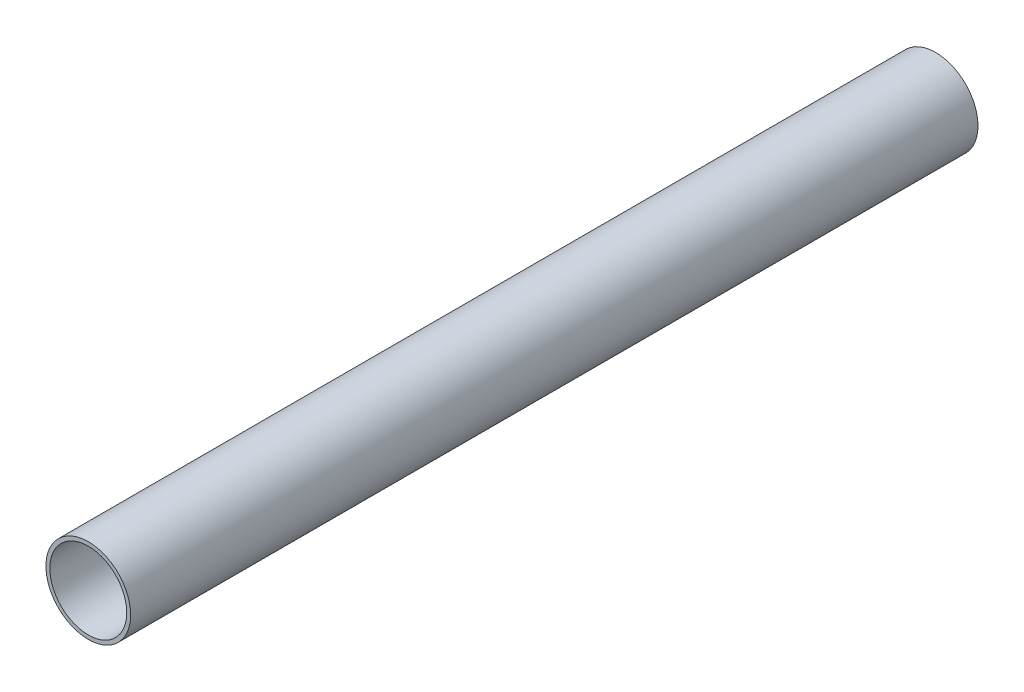
ISO-10303-21;
HEADER;
FILE_DESCRIPTION(('STEP AP214'),'2;1');
FILE_NAME('part.step','',(''),(''),'','','');
FILE_SCHEMA(('AUTOMOTIVE_DESIGN { 1 0 10303 214 1 1 1 1 }'));
ENDSEC;
DATA;
#1=APPLICATION_CONTEXT('core data for automotive mechanical design processes');
#2=APPLICATION_PROTOCOL_DEFINITION('international standard','automotive_design',2000,#1);
#3=PRODUCT_CONTEXT('',#1,'mechanical');
#4=PRODUCT('Part','Part','',(#3));
#5=PRODUCT_RELATED_PRODUCT_CATEGORY('part','',(#4));
#6=PRODUCT_DEFINITION_FORMATION('','',#4);
#7=PRODUCT_DEFINITION_CONTEXT('part definition',#1,'design');
#8=PRODUCT_DEFINITION('design','',#6,#7);
#9=PRODUCT_DEFINITION_SHAPE('','',#8);
#10=(LENGTH_UNIT() NAMED_UNIT(*) SI_UNIT(.MILLI.,.METRE.));
#11=(NAMED_UNIT(*) PLANE_ANGLE_UNIT() SI_UNIT($,.RADIAN.));
#12=(NAMED_UNIT(*) SI_UNIT($,.STERADIAN.) SOLID_ANGLE_UNIT());
#13=UNCERTAINTY_MEASURE_WITH_UNIT(LENGTH_MEASURE(1.E-05),#10,'distance_accuracy_value','');
#14=(GEOMETRIC_REPRESENTATION_CONTEXT(3) GLOBAL_UNCERTAINTY_ASSIGNED_CONTEXT((#13)) GLOBAL_UNIT_ASSIGNED_CONTEXT((#10,
#11,#12)) REPRESENTATION_CONTEXT('',''));
#15=CARTESIAN_POINT('',(0.,0.,0.));
#16=DIRECTION('',(0.,0.,1.));
#17=DIRECTION('',(1.,0.,0.));
#18=AXIS2_PLACEMENT_3D('',#15,#16,#17);
#19=CARTESIAN_POINT('',(0.,0.,250.));
#20=DIRECTION('',(0.,0.,1.));
#21=DIRECTION('',(1.,0.,0.));
#22=AXIS2_PLACEMENT_3D('',#19,#20,#21);
#23=PLANE('',#22);
#24=CARTESIAN_POINT('',(0.,0.,250.));
#25=DIRECTION('',(0.,0.,1.));
#26=DIRECTION('',(1.,0.,0.));
#27=AXIS2_PLACEMENT_3D('',#24,#25,#26);
#28=CIRCLE('',#27,12.5);
#29=CARTESIAN_POINT('',(12.5,0.,250.));
#30=VERTEX_POINT('',#29);
#31=EDGE_CURVE('E10',#30,#30,#28,.T.);
#32=ORIENTED_EDGE('',*,*,#31,.T.);
#33=EDGE_LOOP('',(#32));
#34=FACE_BOUND('',#33,.T.);
#35=CARTESIAN_POINT('',(0.,0.,250.));
#36=DIRECTION('',(0.,0.,1.));
#37=DIRECTION('',(1.,0.,0.));
#38=AXIS2_PLACEMENT_3D('',#35,#36,#37);
#39=CIRCLE('',#38,11.35);
#40=CARTESIAN_POINT('',(11.35,0.,250.));
#41=VERTEX_POINT('',#40);
#42=EDGE_CURVE('E48',#41,#41,#39,.T.);
#43=ORIENTED_EDGE('',*,*,#42,.F.);
#44=EDGE_LOOP('',(#43));
#45=FACE_BOUND('',#44,.T.);
#46=ADVANCED_FACE('F36',(#34,#45),#23,.T.);
#47=CARTESIAN_POINT('',(0.,0.,0.));
#48=DIRECTION('',(0.,0.,1.));
#49=DIRECTION('',(1.,0.,0.));
#50=AXIS2_PLACEMENT_3D('',#47,#48,#49);
#51=PLANE('',#50);
#52=CARTESIAN_POINT('',(0.,0.,0.));
#53=DIRECTION('',(0.,0.,1.));
#54=DIRECTION('',(1.,0.,0.));
#55=AXIS2_PLACEMENT_3D('',#52,#53,#54);
#56=CIRCLE('',#55,12.5);
#57=CARTESIAN_POINT('',(12.5,0.,0.));
#58=VERTEX_POINT('',#57);
#59=EDGE_CURVE('E40',#58,#58,#56,.T.);
#60=ORIENTED_EDGE('',*,*,#59,.F.);
#61=EDGE_LOOP('',(#60));
#62=FACE_BOUND('',#61,.T.);
#63=CARTESIAN_POINT('',(0.,0.,0.));
#64=DIRECTION('',(0.,0.,1.));
#65=DIRECTION('',(1.,0.,0.));
#66=AXIS2_PLACEMENT_3D('',#63,#64,#65);
#67=CIRCLE('',#66,11.35);
#68=CARTESIAN_POINT('',(11.35,0.,0.));
#69=VERTEX_POINT('',#68);
#70=EDGE_CURVE('E50',#69,#69,#67,.T.);
#71=ORIENTED_EDGE('',*,*,#70,.T.);
#72=EDGE_LOOP('',(#71));
#73=FACE_BOUND('',#72,.T.);
#74=ADVANCED_FACE('F61',(#62,#73),#51,.F.);
#75=CARTESIAN_POINT('',(0.,0.,250.));
#76=DIRECTION('',(0.,0.,-1.));
#77=DIRECTION('',(-1.,0.,0.));
#78=AXIS2_PLACEMENT_3D('',#75,#76,#77);
#79=CYLINDRICAL_SURFACE('',#78,12.5);
#80=ORIENTED_EDGE('',*,*,#31,.F.);
#81=EDGE_LOOP('',(#80));
#82=FACE_BOUND('',#81,.T.);
#83=ORIENTED_EDGE('',*,*,#59,.T.);
#84=EDGE_LOOP('',(#83));
#85=FACE_BOUND('',#84,.T.);
#86=ADVANCED_FACE('F38',(#82,#85),#79,.T.);
#87=CARTESIAN_POINT('',(0.,0.,250.));
#88=DIRECTION('',(0.,0.,-1.));
#89=DIRECTION('',(-1.,0.,0.));
#90=AXIS2_PLACEMENT_3D('',#87,#88,#89);
#91=CYLINDRICAL_SURFACE('',#90,11.35);
#92=ORIENTED_EDGE('',*,*,#42,.T.);
#93=EDGE_LOOP('',(#92));
#94=FACE_BOUND('',#93,.T.);
#95=ORIENTED_EDGE('',*,*,#70,.F.);
#96=EDGE_LOOP('',(#95));
#97=FACE_BOUND('',#96,.T.);
#98=ADVANCED_FACE('F57',(#94,#97),#91,.F.);
#99=CLOSED_SHELL('',(#46,#74,#86,#98));
#100=MANIFOLD_SOLID_BREP('B2',#99);
#101=ADVANCED_BREP_SHAPE_REPRESENTATION('',(#18,#100),#14);
#102=SHAPE_DEFINITION_REPRESENTATION(#9,#101);
ENDSEC;
END-ISO-10303-21;
